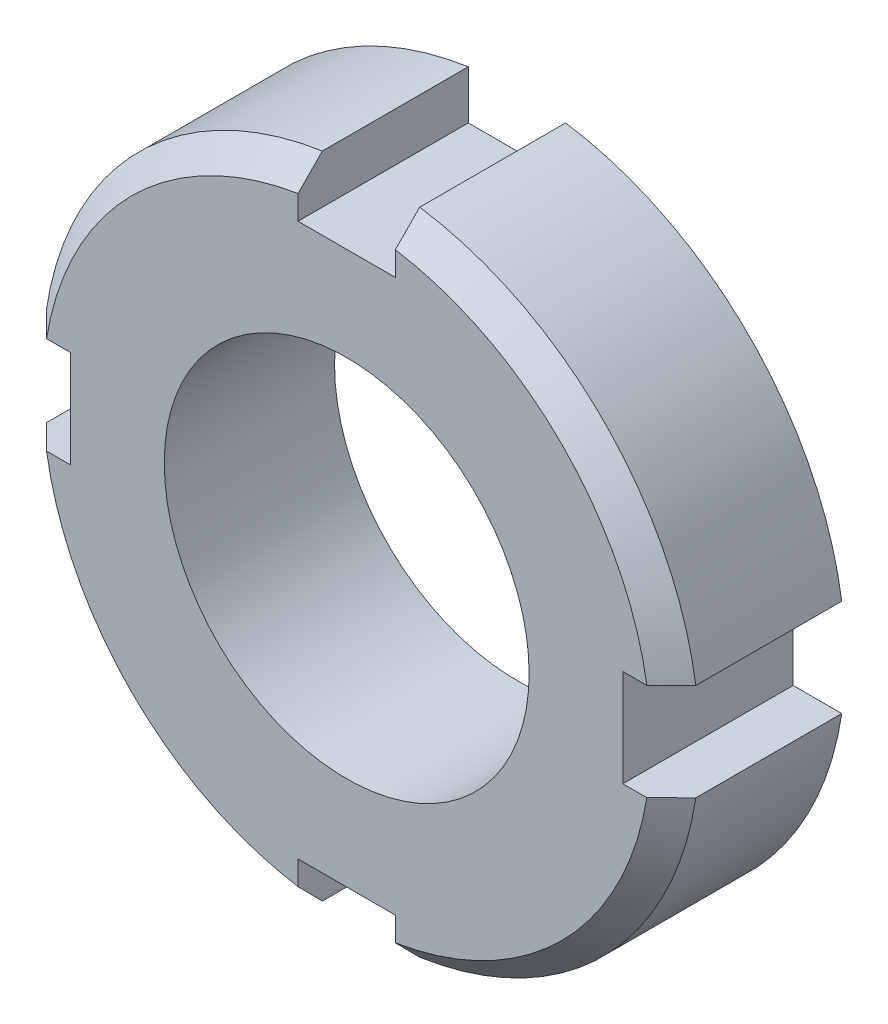
ISO-10303-21;
HEADER;
FILE_DESCRIPTION(('STEP AP214'),'2;1');
FILE_NAME('part.step','',(''),(''),'','','');
FILE_SCHEMA(('AUTOMOTIVE_DESIGN { 1 0 10303 214 1 1 1 1 }'));
ENDSEC;
DATA;
#1=APPLICATION_CONTEXT('core data for automotive mechanical design processes');
#2=APPLICATION_PROTOCOL_DEFINITION('international standard','automotive_design',2000,#1);
#3=PRODUCT_CONTEXT('',#1,'mechanical');
#4=PRODUCT('Part','Part','',(#3));
#5=PRODUCT_RELATED_PRODUCT_CATEGORY('part','',(#4));
#6=PRODUCT_DEFINITION_FORMATION('','',#4);
#7=PRODUCT_DEFINITION_CONTEXT('part definition',#1,'design');
#8=PRODUCT_DEFINITION('design','',#6,#7);
#9=PRODUCT_DEFINITION_SHAPE('','',#8);
#10=(LENGTH_UNIT() NAMED_UNIT(*) SI_UNIT(.MILLI.,.METRE.));
#11=(NAMED_UNIT(*) PLANE_ANGLE_UNIT() SI_UNIT($,.RADIAN.));
#12=(NAMED_UNIT(*) SI_UNIT($,.STERADIAN.) SOLID_ANGLE_UNIT());
#13=UNCERTAINTY_MEASURE_WITH_UNIT(LENGTH_MEASURE(1.E-05),#10,'distance_accuracy_value','');
#14=(GEOMETRIC_REPRESENTATION_CONTEXT(3) GLOBAL_UNCERTAINTY_ASSIGNED_CONTEXT((#13)) GLOBAL_UNIT_ASSIGNED_CONTEXT((#10,
#11,#12)) REPRESENTATION_CONTEXT('',''));
#15=CARTESIAN_POINT('',(0.,0.,0.));
#16=DIRECTION('',(0.,0.,1.));
#17=DIRECTION('',(1.,0.,0.));
#18=AXIS2_PLACEMENT_3D('',#15,#16,#17);
#19=CARTESIAN_POINT('',(0.,0.,7.));
#20=DIRECTION('',(0.,0.,-1.));
#21=DIRECTION('',(-1.,0.,0.));
#22=AXIS2_PLACEMENT_3D('',#19,#20,#21);
#23=CYLINDRICAL_SURFACE('',#22,13.5);
#24=DIRECTION('',(0.,0.,1.));
#25=VECTOR('',#24,1.);
#26=CARTESIAN_POINT('',(-13.351029922821,1.99999999999772,0.));
#27=LINE('',#26,#25);
#28=CARTESIAN_POINT('',(-13.351029922821,1.99999999999772,0.));
#29=VERTEX_POINT('',#28);
#30=CARTESIAN_POINT('',(-13.351029922821,1.99999999999772,6.));
#31=VERTEX_POINT('',#30);
#32=EDGE_CURVE('E572',#29,#31,#27,.T.);
#33=ORIENTED_EDGE('',*,*,#32,.T.);
#34=CARTESIAN_POINT('',(0.,0.,6.));
#35=DIRECTION('',(0.,0.,1.));
#36=DIRECTION('',(1.,0.,0.));
#37=AXIS2_PLACEMENT_3D('',#34,#35,#36);
#38=CIRCLE('',#37,13.5);
#39=CARTESIAN_POINT('',(-2.,13.3510299228187,6.));
#40=VERTEX_POINT('',#39);
#41=EDGE_CURVE('E299',#31,#40,#38,.F.);
#42=ORIENTED_EDGE('',*,*,#41,.T.);
#43=DIRECTION('',(0.,0.,1.));
#44=VECTOR('',#43,1.);
#45=CARTESIAN_POINT('',(-2.,13.3510299228187,0.));
#46=LINE('',#45,#44);
#47=CARTESIAN_POINT('',(-2.,13.3510299228187,0.));
#48=VERTEX_POINT('',#47);
#49=EDGE_CURVE('E276',#48,#40,#46,.T.);
#50=ORIENTED_EDGE('',*,*,#49,.F.);
#51=CARTESIAN_POINT('',(0.,0.,0.));
#52=DIRECTION('',(0.,0.,1.));
#53=DIRECTION('',(1.,0.,0.));
#54=AXIS2_PLACEMENT_3D('',#51,#52,#53);
#55=CIRCLE('',#54,13.5);
#56=EDGE_CURVE('E294',#48,#29,#55,.T.);
#57=ORIENTED_EDGE('',*,*,#56,.T.);
#58=EDGE_LOOP('',(#33,#42,#50,#57));
#59=FACE_BOUND('',#58,.T.);
#60=ADVANCED_FACE('F131',(#59),#23,.T.);
#61=DIRECTION('',(0.,0.,1.));
#62=VECTOR('',#61,1.);
#63=CARTESIAN_POINT('',(2.,13.3510299228187,0.));
#64=LINE('',#63,#62);
#65=CARTESIAN_POINT('',(2.,13.3510299228187,0.));
#66=VERTEX_POINT('',#65);
#67=CARTESIAN_POINT('',(2.,13.3510299228187,6.));
#68=VERTEX_POINT('',#67);
#69=EDGE_CURVE('E442',#66,#68,#64,.T.);
#70=ORIENTED_EDGE('',*,*,#69,.T.);
#71=CARTESIAN_POINT('',(0.,0.,6.));
#72=DIRECTION('',(0.,0.,1.));
#73=DIRECTION('',(1.,0.,0.));
#74=AXIS2_PLACEMENT_3D('',#71,#72,#73);
#75=CIRCLE('',#74,13.5);
#76=CARTESIAN_POINT('',(13.351029922821,1.99999999999773,6.));
#77=VERTEX_POINT('',#76);
#78=EDGE_CURVE('E146',#68,#77,#75,.F.);
#79=ORIENTED_EDGE('',*,*,#78,.T.);
#80=DIRECTION('',(0.,0.,1.));
#81=VECTOR('',#80,1.);
#82=CARTESIAN_POINT('',(13.351029922821,1.99999999999773,0.));
#83=LINE('',#82,#81);
#84=CARTESIAN_POINT('',(13.351029922821,1.99999999999773,0.));
#85=VERTEX_POINT('',#84);
#86=EDGE_CURVE('E482',#85,#77,#83,.T.);
#87=ORIENTED_EDGE('',*,*,#86,.F.);
#88=EDGE_CURVE('E303',#85,#66,#55,.T.);
#89=ORIENTED_EDGE('',*,*,#88,.T.);
#90=EDGE_LOOP('',(#70,#79,#87,#89));
#91=FACE_BOUND('',#90,.T.);
#92=ADVANCED_FACE('F431',(#91),#23,.T.);
#93=DIRECTION('',(0.,0.,1.));
#94=VECTOR('',#93,1.);
#95=CARTESIAN_POINT('',(13.351029922821,-2.00000000000227,0.));
#96=LINE('',#95,#94);
#97=CARTESIAN_POINT('',(13.351029922821,-2.00000000000227,0.));
#98=VERTEX_POINT('',#97);
#99=CARTESIAN_POINT('',(13.351029922821,-2.00000000000227,5.99999999999999));
#100=VERTEX_POINT('',#99);
#101=EDGE_CURVE('E502',#98,#100,#96,.T.);
#102=ORIENTED_EDGE('',*,*,#101,.T.);
#103=CARTESIAN_POINT('',(0.,0.,5.99999999999999));
#104=DIRECTION('',(0.,0.,1.));
#105=DIRECTION('',(1.,0.,0.));
#106=AXIS2_PLACEMENT_3D('',#103,#104,#105);
#107=CIRCLE('',#106,13.5);
#108=CARTESIAN_POINT('',(2.00000000000001,-13.3510299228232,5.99999999999999));
#109=VERTEX_POINT('',#108);
#110=EDGE_CURVE('E345',#100,#109,#107,.F.);
#111=ORIENTED_EDGE('',*,*,#110,.T.);
#112=DIRECTION('',(0.,0.,1.));
#113=VECTOR('',#112,1.);
#114=CARTESIAN_POINT('',(2.00000000000001,-13.3510299228232,0.));
#115=LINE('',#114,#113);
#116=CARTESIAN_POINT('',(2.00000000000001,-13.3510299228232,0.));
#117=VERTEX_POINT('',#116);
#118=EDGE_CURVE('E527',#117,#109,#115,.T.);
#119=ORIENTED_EDGE('',*,*,#118,.F.);
#120=EDGE_CURVE('E311',#117,#98,#55,.T.);
#121=ORIENTED_EDGE('',*,*,#120,.T.);
#122=EDGE_LOOP('',(#102,#111,#119,#121));
#123=FACE_BOUND('',#122,.T.);
#124=ADVANCED_FACE('F426',(#123),#23,.T.);
#125=DIRECTION('',(0.,0.,1.));
#126=VECTOR('',#125,1.);
#127=CARTESIAN_POINT('',(-2.,-13.3510299228232,0.));
#128=LINE('',#127,#126);
#129=CARTESIAN_POINT('',(-2.,-13.3510299228232,0.));
#130=VERTEX_POINT('',#129);
#131=CARTESIAN_POINT('',(-2.,-13.3510299228232,6.));
#132=VERTEX_POINT('',#131);
#133=EDGE_CURVE('E537',#130,#132,#128,.T.);
#134=ORIENTED_EDGE('',*,*,#133,.T.);
#135=CARTESIAN_POINT('',(0.,0.,6.));
#136=DIRECTION('',(0.,0.,1.));
#137=DIRECTION('',(1.,0.,0.));
#138=AXIS2_PLACEMENT_3D('',#135,#136,#137);
#139=CIRCLE('',#138,13.5);
#140=CARTESIAN_POINT('',(-13.351029922821,-2.00000000000228,6.));
#141=VERTEX_POINT('',#140);
#142=EDGE_CURVE('E378',#132,#141,#139,.F.);
#143=ORIENTED_EDGE('',*,*,#142,.T.);
#144=DIRECTION('',(0.,0.,1.));
#145=VECTOR('',#144,1.);
#146=CARTESIAN_POINT('',(-13.351029922821,-2.00000000000228,0.));
#147=LINE('',#146,#145);
#148=CARTESIAN_POINT('',(-13.351029922821,-2.00000000000228,0.));
#149=VERTEX_POINT('',#148);
#150=EDGE_CURVE('E563',#149,#141,#147,.T.);
#151=ORIENTED_EDGE('',*,*,#150,.F.);
#152=EDGE_CURVE('E308',#149,#130,#55,.T.);
#153=ORIENTED_EDGE('',*,*,#152,.T.);
#154=EDGE_LOOP('',(#134,#143,#151,#153));
#155=FACE_BOUND('',#154,.T.);
#156=ADVANCED_FACE('F423',(#155),#23,.T.);
#157=CARTESIAN_POINT('',(0.,0.,7.));
#158=DIRECTION('',(0.,0.,1.));
#159=DIRECTION('',(1.,0.,0.));
#160=AXIS2_PLACEMENT_3D('',#157,#158,#159);
#161=PLANE('',#160);
#162=CARTESIAN_POINT('',(0.,0.,7.));
#163=DIRECTION('',(0.,0.,1.));
#164=DIRECTION('',(1.,0.,0.));
#165=AXIS2_PLACEMENT_3D('',#162,#163,#164);
#166=CIRCLE('',#165,7.5);
#167=CARTESIAN_POINT('',(7.5,0.,7.));
#168=VERTEX_POINT('',#167);
#169=EDGE_CURVE('E820',#168,#168,#166,.T.);
#170=ORIENTED_EDGE('',*,*,#169,.F.);
#171=EDGE_LOOP('',(#170));
#172=FACE_BOUND('',#171,.T.);
#173=DIRECTION('',(0.,1.,0.));
#174=VECTOR('',#173,1.);
#175=CARTESIAN_POINT('',(2.00000000000001,-13.3510299228232,7.));
#176=LINE('',#175,#174);
#177=CARTESIAN_POINT('',(2.00000000000001,-12.3389626792531,7.));
#178=VERTEX_POINT('',#177);
#179=CARTESIAN_POINT('',(2.,-11.3510299228232,7.));
#180=VERTEX_POINT('',#179);
#181=EDGE_CURVE('E508',#178,#180,#176,.T.);
#182=ORIENTED_EDGE('',*,*,#181,.F.);
#183=CARTESIAN_POINT('',(0.,0.,7.));
#184=DIRECTION('',(0.,0.,1.));
#185=DIRECTION('',(1.,0.,0.));
#186=AXIS2_PLACEMENT_3D('',#183,#184,#185);
#187=CIRCLE('',#186,12.5);
#188=CARTESIAN_POINT('',(12.3389626792527,-2.00000000000227,7.));
#189=VERTEX_POINT('',#188);
#190=EDGE_CURVE('E329',#178,#189,#187,.T.);
#191=ORIENTED_EDGE('',*,*,#190,.T.);
#192=DIRECTION('',(1.,0.,0.));
#193=VECTOR('',#192,1.);
#194=CARTESIAN_POINT('',(11.351029922821,-2.00000000000227,7.));
#195=LINE('',#194,#193);
#196=CARTESIAN_POINT('',(11.351029922821,-2.00000000000227,7.));
#197=VERTEX_POINT('',#196);
#198=EDGE_CURVE('E507',#197,#189,#195,.T.);
#199=ORIENTED_EDGE('',*,*,#198,.F.);
#200=DIRECTION('',(0.,-1.,0.));
#201=VECTOR('',#200,1.);
#202=CARTESIAN_POINT('',(11.351029922821,1.99999999999773,7.));
#203=LINE('',#202,#201);
#204=CARTESIAN_POINT('',(11.351029922821,1.99999999999773,7.));
#205=VERTEX_POINT('',#204);
#206=EDGE_CURVE('E514',#205,#197,#203,.T.);
#207=ORIENTED_EDGE('',*,*,#206,.F.);
#208=DIRECTION('',(-1.,0.,0.));
#209=VECTOR('',#208,1.);
#210=CARTESIAN_POINT('',(13.351029922821,1.99999999999773,7.));
#211=LINE('',#210,#209);
#212=CARTESIAN_POINT('',(12.3389626792534,1.99999999999773,7.));
#213=VERTEX_POINT('',#212);
#214=EDGE_CURVE('E520',#213,#205,#211,.T.);
#215=ORIENTED_EDGE('',*,*,#214,.F.);
#216=CARTESIAN_POINT('',(0.,0.,7.));
#217=DIRECTION('',(0.,0.,1.));
#218=DIRECTION('',(1.,0.,0.));
#219=AXIS2_PLACEMENT_3D('',#216,#217,#218);
#220=CIRCLE('',#219,12.5);
#221=CARTESIAN_POINT('',(2.,12.3389626792531,7.));
#222=VERTEX_POINT('',#221);
#223=EDGE_CURVE('E315',#213,#222,#220,.T.);
#224=ORIENTED_EDGE('',*,*,#223,.T.);
#225=DIRECTION('',(0.,1.,0.));
#226=VECTOR('',#225,1.);
#227=CARTESIAN_POINT('',(2.,11.3510299228187,7.));
#228=LINE('',#227,#226);
#229=CARTESIAN_POINT('',(2.,11.3510299228187,7.));
#230=VERTEX_POINT('',#229);
#231=EDGE_CURVE('E288',#230,#222,#228,.T.);
#232=ORIENTED_EDGE('',*,*,#231,.F.);
#233=DIRECTION('',(1.,0.,0.));
#234=VECTOR('',#233,1.);
#235=CARTESIAN_POINT('',(-2.,11.3510299228187,7.));
#236=LINE('',#235,#234);
#237=CARTESIAN_POINT('',(-2.,11.3510299228187,7.));
#238=VERTEX_POINT('',#237);
#239=EDGE_CURVE('E640',#238,#230,#236,.T.);
#240=ORIENTED_EDGE('',*,*,#239,.F.);
#241=DIRECTION('',(0.,-1.,0.));
#242=VECTOR('',#241,1.);
#243=CARTESIAN_POINT('',(-2.,13.3510299228187,7.));
#244=LINE('',#243,#242);
#245=CARTESIAN_POINT('',(-2.,12.3389626792531,7.));
#246=VERTEX_POINT('',#245);
#247=EDGE_CURVE('E517',#246,#238,#244,.T.);
#248=ORIENTED_EDGE('',*,*,#247,.F.);
#249=CARTESIAN_POINT('',(0.,0.,7.));
#250=DIRECTION('',(0.,0.,1.));
#251=DIRECTION('',(1.,0.,0.));
#252=AXIS2_PLACEMENT_3D('',#249,#250,#251);
#253=CIRCLE('',#252,12.5);
#254=CARTESIAN_POINT('',(-12.3389626792534,1.99999999999772,7.));
#255=VERTEX_POINT('',#254);
#256=EDGE_CURVE('E325',#246,#255,#253,.T.);
#257=ORIENTED_EDGE('',*,*,#256,.T.);
#258=DIRECTION('',(-1.,0.,0.));
#259=VECTOR('',#258,1.);
#260=CARTESIAN_POINT('',(-11.351029922821,1.99999999999772,7.));
#261=LINE('',#260,#259);
#262=CARTESIAN_POINT('',(-11.351029922821,1.99999999999772,7.));
#263=VERTEX_POINT('',#262);
#264=EDGE_CURVE('E576',#263,#255,#261,.T.);
#265=ORIENTED_EDGE('',*,*,#264,.F.);
#266=DIRECTION('',(0.,1.,0.));
#267=VECTOR('',#266,1.);
#268=CARTESIAN_POINT('',(-11.351029922821,-2.00000000000228,7.));
#269=LINE('',#268,#267);
#270=CARTESIAN_POINT('',(-11.351029922821,-2.00000000000228,7.));
#271=VERTEX_POINT('',#270);
#272=EDGE_CURVE('E581',#271,#263,#269,.T.);
#273=ORIENTED_EDGE('',*,*,#272,.F.);
#274=DIRECTION('',(1.,0.,0.));
#275=VECTOR('',#274,1.);
#276=CARTESIAN_POINT('',(-13.351029922821,-2.00000000000228,7.));
#277=LINE('',#276,#275);
#278=CARTESIAN_POINT('',(-12.3389626792527,-2.00000000000228,7.));
#279=VERTEX_POINT('',#278);
#280=EDGE_CURVE('E545',#279,#271,#277,.T.);
#281=ORIENTED_EDGE('',*,*,#280,.F.);
#282=CARTESIAN_POINT('',(0.,0.,7.));
#283=DIRECTION('',(0.,0.,1.));
#284=DIRECTION('',(1.,0.,0.));
#285=AXIS2_PLACEMENT_3D('',#282,#283,#284);
#286=CIRCLE('',#285,12.5);
#287=CARTESIAN_POINT('',(-2.,-12.3389626792531,7.));
#288=VERTEX_POINT('',#287);
#289=EDGE_CURVE('E326',#279,#288,#286,.T.);
#290=ORIENTED_EDGE('',*,*,#289,.T.);
#291=DIRECTION('',(0.,-1.,0.));
#292=VECTOR('',#291,1.);
#293=CARTESIAN_POINT('',(-1.99999999999999,-11.3510299228232,7.));
#294=LINE('',#293,#292);
#295=CARTESIAN_POINT('',(-1.99999999999999,-11.3510299228232,7.));
#296=VERTEX_POINT('',#295);
#297=EDGE_CURVE('E543',#296,#288,#294,.T.);
#298=ORIENTED_EDGE('',*,*,#297,.F.);
#299=DIRECTION('',(-1.,0.,0.));
#300=VECTOR('',#299,1.);
#301=CARTESIAN_POINT('',(2.,-11.3510299228232,7.));
#302=LINE('',#301,#300);
#303=EDGE_CURVE('E550',#180,#296,#302,.T.);
#304=ORIENTED_EDGE('',*,*,#303,.F.);
#305=EDGE_LOOP('',(#182,#191,#199,#207,#215,#224,#232,#240,#248,#257,#265,#273,#281,#290,#298,#304));
#306=FACE_BOUND('',#305,.T.);
#307=ADVANCED_FACE('F416',(#172,#306),#161,.T.);
#308=CARTESIAN_POINT('',(0.,0.,0.));
#309=DIRECTION('',(0.,0.,1.));
#310=DIRECTION('',(1.,0.,0.));
#311=AXIS2_PLACEMENT_3D('',#308,#309,#310);
#312=PLANE('',#311);
#313=CARTESIAN_POINT('',(0.,0.,0.));
#314=DIRECTION('',(0.,0.,1.));
#315=DIRECTION('',(1.,0.,0.));
#316=AXIS2_PLACEMENT_3D('',#313,#314,#315);
#317=CIRCLE('',#316,7.5);
#318=CARTESIAN_POINT('',(7.5,0.,0.));
#319=VERTEX_POINT('',#318);
#320=EDGE_CURVE('E579',#319,#319,#317,.T.);
#321=ORIENTED_EDGE('',*,*,#320,.T.);
#322=EDGE_LOOP('',(#321));
#323=FACE_BOUND('',#322,.T.);
#324=DIRECTION('',(1.,0.,0.));
#325=VECTOR('',#324,1.);
#326=CARTESIAN_POINT('',(-2.,11.3510299228187,0.));
#327=LINE('',#326,#325);
#328=CARTESIAN_POINT('',(-2.,11.3510299228187,0.));
#329=VERTEX_POINT('',#328);
#330=CARTESIAN_POINT('',(2.,11.3510299228187,0.));
#331=VERTEX_POINT('',#330);
#332=EDGE_CURVE('E290',#329,#331,#327,.T.);
#333=ORIENTED_EDGE('',*,*,#332,.T.);
#334=DIRECTION('',(0.,1.,0.));
#335=VECTOR('',#334,1.);
#336=CARTESIAN_POINT('',(2.,11.3510299228187,0.));
#337=LINE('',#336,#335);
#338=EDGE_CURVE('E300',#331,#66,#337,.T.);
#339=ORIENTED_EDGE('',*,*,#338,.T.);
#340=ORIENTED_EDGE('',*,*,#88,.F.);
#341=DIRECTION('',(-1.,0.,0.));
#342=VECTOR('',#341,1.);
#343=CARTESIAN_POINT('',(13.351029922821,1.99999999999773,0.));
#344=LINE('',#343,#342);
#345=CARTESIAN_POINT('',(11.351029922821,1.99999999999773,0.));
#346=VERTEX_POINT('',#345);
#347=EDGE_CURVE('E490',#85,#346,#344,.T.);
#348=ORIENTED_EDGE('',*,*,#347,.T.);
#349=DIRECTION('',(0.,-1.,0.));
#350=VECTOR('',#349,1.);
#351=CARTESIAN_POINT('',(11.351029922821,1.99999999999773,0.));
#352=LINE('',#351,#350);
#353=CARTESIAN_POINT('',(11.351029922821,-2.00000000000227,0.));
#354=VERTEX_POINT('',#353);
#355=EDGE_CURVE('E497',#346,#354,#352,.T.);
#356=ORIENTED_EDGE('',*,*,#355,.T.);
#357=DIRECTION('',(1.,0.,0.));
#358=VECTOR('',#357,1.);
#359=CARTESIAN_POINT('',(11.351029922821,-2.00000000000227,0.));
#360=LINE('',#359,#358);
#361=EDGE_CURVE('E487',#354,#98,#360,.T.);
#362=ORIENTED_EDGE('',*,*,#361,.T.);
#363=ORIENTED_EDGE('',*,*,#120,.F.);
#364=DIRECTION('',(0.,1.,0.));
#365=VECTOR('',#364,1.);
#366=CARTESIAN_POINT('',(2.00000000000001,-13.3510299228232,0.));
#367=LINE('',#366,#365);
#368=CARTESIAN_POINT('',(2.,-11.3510299228232,0.));
#369=VERTEX_POINT('',#368);
#370=EDGE_CURVE('E547',#117,#369,#367,.T.);
#371=ORIENTED_EDGE('',*,*,#370,.T.);
#372=DIRECTION('',(-1.,0.,0.));
#373=VECTOR('',#372,1.);
#374=CARTESIAN_POINT('',(2.,-11.3510299228232,0.));
#375=LINE('',#374,#373);
#376=CARTESIAN_POINT('',(-1.99999999999999,-11.3510299228232,0.));
#377=VERTEX_POINT('',#376);
#378=EDGE_CURVE('E556',#369,#377,#375,.T.);
#379=ORIENTED_EDGE('',*,*,#378,.T.);
#380=DIRECTION('',(0.,-1.,0.));
#381=VECTOR('',#380,1.);
#382=CARTESIAN_POINT('',(-1.99999999999999,-11.3510299228232,0.));
#383=LINE('',#382,#381);
#384=EDGE_CURVE('E533',#377,#130,#383,.T.);
#385=ORIENTED_EDGE('',*,*,#384,.T.);
#386=ORIENTED_EDGE('',*,*,#152,.F.);
#387=DIRECTION('',(1.,0.,0.));
#388=VECTOR('',#387,1.);
#389=CARTESIAN_POINT('',(-13.351029922821,-2.00000000000228,0.));
#390=LINE('',#389,#388);
#391=CARTESIAN_POINT('',(-11.351029922821,-2.00000000000228,0.));
#392=VERTEX_POINT('',#391);
#393=EDGE_CURVE('E320',#149,#392,#390,.T.);
#394=ORIENTED_EDGE('',*,*,#393,.T.);
#395=DIRECTION('',(0.,1.,0.));
#396=VECTOR('',#395,1.);
#397=CARTESIAN_POINT('',(-11.351029922821,-2.00000000000228,0.));
#398=LINE('',#397,#396);
#399=CARTESIAN_POINT('',(-11.351029922821,1.99999999999772,0.));
#400=VERTEX_POINT('',#399);
#401=EDGE_CURVE('E587',#392,#400,#398,.T.);
#402=ORIENTED_EDGE('',*,*,#401,.T.);
#403=DIRECTION('',(-1.,0.,0.));
#404=VECTOR('',#403,1.);
#405=CARTESIAN_POINT('',(-11.351029922821,1.99999999999772,0.));
#406=LINE('',#405,#404);
#407=EDGE_CURVE('E304',#400,#29,#406,.T.);
#408=ORIENTED_EDGE('',*,*,#407,.T.);
#409=ORIENTED_EDGE('',*,*,#56,.F.);
#410=DIRECTION('',(0.,-1.,0.));
#411=VECTOR('',#410,1.);
#412=CARTESIAN_POINT('',(-2.,13.3510299228187,0.));
#413=LINE('',#412,#411);
#414=EDGE_CURVE('E277',#48,#329,#413,.T.);
#415=ORIENTED_EDGE('',*,*,#414,.T.);
#416=EDGE_LOOP('',(#333,#339,#340,#348,#356,#362,#363,#371,#379,#385,#386,#394,#402,#408,#409,#415));
#417=FACE_BOUND('',#416,.T.);
#418=ADVANCED_FACE('F302',(#323,#417),#312,.F.);
#419=CARTESIAN_POINT('',(-11.351029922821,1.99999999999772,0.));
#420=DIRECTION('',(0.,1.,0.));
#421=DIRECTION('',(-1.,0.,0.));
#422=AXIS2_PLACEMENT_3D('',#419,#420,#421);
#423=PLANE('',#422);
#424=ORIENTED_EDGE('',*,*,#264,.T.);
#425=CARTESIAN_POINT('',(-12.3389626792534,1.99999999999772,7.));
#426=CARTESIAN_POINT('',(-12.507718368796,1.99999999999772,6.83341208726107));
#427=CARTESIAN_POINT('',(-12.6764351507077,1.99999999999772,6.66678479738352));
#428=CARTESIAN_POINT('',(-13.0137908985626,1.99999999999772,6.33345146404985));
#429=CARTESIAN_POINT('',(-13.1824298645061,1.99999999999772,6.16674542059406));
#430=CARTESIAN_POINT('',(-13.3510299228191,1.99999999999772,5.99999999999998));
#431=B_SPLINE_CURVE_WITH_KNOTS('',3,(#425,#426,#427,#428,#429,#430),.UNSPECIFIED.,.F.,.F.,(4,2,
4),(0.,0.71138601059862,1.42277201821501),.UNSPECIFIED.);
#432=EDGE_CURVE('E405',#255,#31,#431,.T.);
#433=ORIENTED_EDGE('',*,*,#432,.T.);
#434=ORIENTED_EDGE('',*,*,#32,.F.);
#435=ORIENTED_EDGE('',*,*,#407,.F.);
#436=DIRECTION('',(0.,0.,1.));
#437=VECTOR('',#436,1.);
#438=CARTESIAN_POINT('',(-11.351029922821,1.99999999999772,0.));
#439=LINE('',#438,#437);
#440=EDGE_CURVE('E571',#400,#263,#439,.T.);
#441=ORIENTED_EDGE('',*,*,#440,.T.);
#442=EDGE_LOOP('',(#424,#433,#434,#435,#441));
#443=FACE_BOUND('',#442,.T.);
#444=ADVANCED_FACE('F414',(#443),#423,.F.);
#445=CARTESIAN_POINT('',(-11.351029922821,-2.00000000000228,0.));
#446=DIRECTION('',(1.,0.,0.));
#447=DIRECTION('',(0.,0.,-1.));
#448=AXIS2_PLACEMENT_3D('',#445,#446,#447);
#449=PLANE('',#448);
#450=ORIENTED_EDGE('',*,*,#272,.T.);
#451=ORIENTED_EDGE('',*,*,#440,.F.);
#452=ORIENTED_EDGE('',*,*,#401,.F.);
#453=DIRECTION('',(0.,0.,1.));
#454=VECTOR('',#453,1.);
#455=CARTESIAN_POINT('',(-11.351029922821,-2.00000000000228,0.));
#456=LINE('',#455,#454);
#457=EDGE_CURVE('E566',#392,#271,#456,.T.);
#458=ORIENTED_EDGE('',*,*,#457,.T.);
#459=EDGE_LOOP('',(#450,#451,#452,#458));
#460=FACE_BOUND('',#459,.T.);
#461=ADVANCED_FACE('F391',(#460),#449,.F.);
#462=CARTESIAN_POINT('',(-13.351029922821,-2.00000000000228,0.));
#463=DIRECTION('',(0.,-1.,0.));
#464=DIRECTION('',(1.,0.,0.));
#465=AXIS2_PLACEMENT_3D('',#462,#463,#464);
#466=PLANE('',#465);
#467=ORIENTED_EDGE('',*,*,#150,.T.);
#468=CARTESIAN_POINT('',(-13.3510299228184,-2.0000000000019,6.));
#469=CARTESIAN_POINT('',(-13.1824298645054,-2.00000000000209,6.16674542059407));
#470=CARTESIAN_POINT('',(-13.0137908985619,-2.00000000000221,6.33345146404985));
#471=CARTESIAN_POINT('',(-12.676435150707,-2.00000000000234,6.66678479738351));
#472=CARTESIAN_POINT('',(-12.5077183687952,-2.00000000000234,6.83341208726107));
#473=CARTESIAN_POINT('',(-12.3389626792527,-2.00000000000228,7.));
#474=B_SPLINE_CURVE_WITH_KNOTS('',3,(#468,#469,#470,#471,#472,#473),.UNSPECIFIED.,.F.,.F.,(4,2,
4),(0.,0.711386007616407,1.42277201821505),.UNSPECIFIED.);
#475=EDGE_CURVE('E392',#141,#279,#474,.T.);
#476=ORIENTED_EDGE('',*,*,#475,.T.);
#477=ORIENTED_EDGE('',*,*,#280,.T.);
#478=ORIENTED_EDGE('',*,*,#457,.F.);
#479=ORIENTED_EDGE('',*,*,#393,.F.);
#480=EDGE_LOOP('',(#467,#476,#477,#478,#479));
#481=FACE_BOUND('',#480,.T.);
#482=ADVANCED_FACE('F390',(#481),#466,.F.);
#483=CARTESIAN_POINT('',(-1.99999999999999,-11.3510299228232,0.));
#484=DIRECTION('',(-1.,0.,0.));
#485=DIRECTION('',(0.,-1.,0.));
#486=AXIS2_PLACEMENT_3D('',#483,#484,#485);
#487=PLANE('',#486);
#488=ORIENTED_EDGE('',*,*,#297,.T.);
#489=CARTESIAN_POINT('',(-2.,-12.3389626792531,7.));
#490=CARTESIAN_POINT('',(-2.,-12.5077183687956,6.83341208726107));
#491=CARTESIAN_POINT('',(-2.,-12.6764351507074,6.66678479738351));
#492=CARTESIAN_POINT('',(-2.,-13.0137908985623,6.33345146404983));
#493=CARTESIAN_POINT('',(-2.,-13.1824298645057,6.16674542059404));
#494=CARTESIAN_POINT('',(-2.,-13.3510299228187,5.99999999999995));
#495=B_SPLINE_CURVE_WITH_KNOTS('',3,(#489,#490,#491,#492,#493,#494),.UNSPECIFIED.,.F.,.F.,(4,2,
4),(0.,0.711386010598648,1.42277201821506),.UNSPECIFIED.);
#496=EDGE_CURVE('E371',#288,#132,#495,.T.);
#497=ORIENTED_EDGE('',*,*,#496,.T.);
#498=ORIENTED_EDGE('',*,*,#133,.F.);
#499=ORIENTED_EDGE('',*,*,#384,.F.);
#500=DIRECTION('',(0.,0.,1.));
#501=VECTOR('',#500,1.);
#502=CARTESIAN_POINT('',(-1.99999999999999,-11.3510299228232,0.));
#503=LINE('',#502,#501);
#504=EDGE_CURVE('E536',#377,#296,#503,.T.);
#505=ORIENTED_EDGE('',*,*,#504,.T.);
#506=EDGE_LOOP('',(#488,#497,#498,#499,#505));
#507=FACE_BOUND('',#506,.T.);
#508=ADVANCED_FACE('F382',(#507),#487,.F.);
#509=CARTESIAN_POINT('',(2.,-11.3510299228232,0.));
#510=DIRECTION('',(0.,1.,0.));
#511=DIRECTION('',(0.,0.,1.));
#512=AXIS2_PLACEMENT_3D('',#509,#510,#511);
#513=PLANE('',#512);
#514=ORIENTED_EDGE('',*,*,#303,.T.);
#515=ORIENTED_EDGE('',*,*,#504,.F.);
#516=ORIENTED_EDGE('',*,*,#378,.F.);
#517=DIRECTION('',(0.,0.,1.));
#518=VECTOR('',#517,1.);
#519=CARTESIAN_POINT('',(2.,-11.3510299228232,0.));
#520=LINE('',#519,#518);
#521=EDGE_CURVE('E535',#369,#180,#520,.T.);
#522=ORIENTED_EDGE('',*,*,#521,.T.);
#523=EDGE_LOOP('',(#514,#515,#516,#522));
#524=FACE_BOUND('',#523,.T.);
#525=ADVANCED_FACE('F363',(#524),#513,.F.);
#526=CARTESIAN_POINT('',(2.00000000000001,-13.3510299228232,0.));
#527=DIRECTION('',(1.,0.,0.));
#528=DIRECTION('',(0.,1.,0.));
#529=AXIS2_PLACEMENT_3D('',#526,#527,#528);
#530=PLANE('',#529);
#531=ORIENTED_EDGE('',*,*,#118,.T.);
#532=CARTESIAN_POINT('',(1.99999999999934,-13.3510299228188,5.99999999999999));
#533=CARTESIAN_POINT('',(1.99999999999967,-13.1824298645058,6.16674542059406));
#534=CARTESIAN_POINT('',(1.99999999999989,-13.0137908985623,6.33345146404983));
#535=CARTESIAN_POINT('',(2.00000000000012,-12.6764351507074,6.6667847973835));
#536=CARTESIAN_POINT('',(2.00000000000012,-12.5077183687956,6.83341208726106));
#537=CARTESIAN_POINT('',(2.00000000000001,-12.3389626792531,7.));
#538=B_SPLINE_CURVE_WITH_KNOTS('',3,(#532,#533,#534,#535,#536,#537),.UNSPECIFIED.,.F.,.F.,(4,2,
4),(0.,0.711386007616423,1.42277201821508),.UNSPECIFIED.);
#539=EDGE_CURVE('E365',#109,#178,#538,.T.);
#540=ORIENTED_EDGE('',*,*,#539,.T.);
#541=ORIENTED_EDGE('',*,*,#181,.T.);
#542=ORIENTED_EDGE('',*,*,#521,.F.);
#543=ORIENTED_EDGE('',*,*,#370,.F.);
#544=EDGE_LOOP('',(#531,#540,#541,#542,#543));
#545=FACE_BOUND('',#544,.T.);
#546=ADVANCED_FACE('F357',(#545),#530,.F.);
#547=CARTESIAN_POINT('',(11.351029922821,-2.00000000000227,0.));
#548=DIRECTION('',(0.,-1.,0.));
#549=DIRECTION('',(1.,0.,0.));
#550=AXIS2_PLACEMENT_3D('',#547,#548,#549);
#551=PLANE('',#550);
#552=ORIENTED_EDGE('',*,*,#198,.T.);
#553=CARTESIAN_POINT('',(12.3389626792527,-2.00000000000227,7.));
#554=CARTESIAN_POINT('',(12.5077183687952,-2.00000000000227,6.83341208726107));
#555=CARTESIAN_POINT('',(12.676435150707,-2.00000000000227,6.66678479738352));
#556=CARTESIAN_POINT('',(13.0137908985619,-2.00000000000227,6.33345146404984));
#557=CARTESIAN_POINT('',(13.1824298645054,-2.00000000000227,6.16674542059405));
#558=CARTESIAN_POINT('',(13.3510299228184,-2.00000000000227,5.99999999999996));
#559=B_SPLINE_CURVE_WITH_KNOTS('',3,(#553,#554,#555,#556,#557,#558),.UNSPECIFIED.,.F.,.F.,(4,2,
4),(0.,0.711386010598651,1.42277201821507),.UNSPECIFIED.);
#560=EDGE_CURVE('E331',#189,#100,#559,.T.);
#561=ORIENTED_EDGE('',*,*,#560,.T.);
#562=ORIENTED_EDGE('',*,*,#101,.F.);
#563=ORIENTED_EDGE('',*,*,#361,.F.);
#564=DIRECTION('',(0.,0.,1.));
#565=VECTOR('',#564,1.);
#566=CARTESIAN_POINT('',(11.351029922821,-2.00000000000227,0.));
#567=LINE('',#566,#565);
#568=EDGE_CURVE('E496',#354,#197,#567,.T.);
#569=ORIENTED_EDGE('',*,*,#568,.T.);
#570=EDGE_LOOP('',(#552,#561,#562,#563,#569));
#571=FACE_BOUND('',#570,.T.);
#572=ADVANCED_FACE('F348',(#571),#551,.F.);
#573=CARTESIAN_POINT('',(11.351029922821,1.99999999999773,0.));
#574=DIRECTION('',(-1.,0.,0.));
#575=DIRECTION('',(0.,0.,1.));
#576=AXIS2_PLACEMENT_3D('',#573,#574,#575);
#577=PLANE('',#576);
#578=ORIENTED_EDGE('',*,*,#206,.T.);
#579=ORIENTED_EDGE('',*,*,#568,.F.);
#580=ORIENTED_EDGE('',*,*,#355,.F.);
#581=DIRECTION('',(0.,0.,1.));
#582=VECTOR('',#581,1.);
#583=CARTESIAN_POINT('',(11.351029922821,1.99999999999773,0.));
#584=LINE('',#583,#582);
#585=EDGE_CURVE('E489',#346,#205,#584,.T.);
#586=ORIENTED_EDGE('',*,*,#585,.T.);
#587=EDGE_LOOP('',(#578,#579,#580,#586));
#588=FACE_BOUND('',#587,.T.);
#589=ADVANCED_FACE('F352',(#588),#577,.F.);
#590=CARTESIAN_POINT('',(13.351029922821,1.99999999999773,0.));
#591=DIRECTION('',(0.,1.,0.));
#592=DIRECTION('',(-1.,0.,0.));
#593=AXIS2_PLACEMENT_3D('',#590,#591,#592);
#594=PLANE('',#593);
#595=ORIENTED_EDGE('',*,*,#86,.T.);
#596=CARTESIAN_POINT('',(13.3510299228191,1.99999999999745,6.));
#597=CARTESIAN_POINT('',(13.1824298645061,1.99999999999759,6.16674542059407));
#598=CARTESIAN_POINT('',(13.0137908985626,1.99999999999768,6.33345146404985));
#599=CARTESIAN_POINT('',(12.6764351507077,1.99999999999778,6.66678479738352));
#600=CARTESIAN_POINT('',(12.507718368796,1.99999999999778,6.83341208726107));
#601=CARTESIAN_POINT('',(12.3389626792534,1.99999999999773,7.));
#602=B_SPLINE_CURVE_WITH_KNOTS('',3,(#596,#597,#598,#599,#600,#601),.UNSPECIFIED.,.F.,.F.,(4,2,
4),(0.,0.711386007616385,1.42277201821501),.UNSPECIFIED.);
#603=EDGE_CURVE('E13',#77,#213,#602,.T.);
#604=ORIENTED_EDGE('',*,*,#603,.T.);
#605=ORIENTED_EDGE('',*,*,#214,.T.);
#606=ORIENTED_EDGE('',*,*,#585,.F.);
#607=ORIENTED_EDGE('',*,*,#347,.F.);
#608=EDGE_LOOP('',(#595,#604,#605,#606,#607));
#609=FACE_BOUND('',#608,.T.);
#610=ADVANCED_FACE('F473',(#609),#594,.F.);
#611=CARTESIAN_POINT('',(2.,11.3510299228187,0.));
#612=DIRECTION('',(1.,0.,0.));
#613=DIRECTION('',(0.,1.,0.));
#614=AXIS2_PLACEMENT_3D('',#611,#612,#613);
#615=PLANE('',#614);
#616=ORIENTED_EDGE('',*,*,#231,.T.);
#617=CARTESIAN_POINT('',(2.,12.3389626792531,7.));
#618=CARTESIAN_POINT('',(2.,12.5077183687956,6.83341208726108));
#619=CARTESIAN_POINT('',(2.,12.6764351507074,6.66678479738353));
#620=CARTESIAN_POINT('',(2.,13.0137908985623,6.33345146404986));
#621=CARTESIAN_POINT('',(2.,13.1824298645057,6.16674542059408));
#622=CARTESIAN_POINT('',(2.,13.3510299228187,6.));
#623=B_SPLINE_CURVE_WITH_KNOTS('',3,(#617,#618,#619,#620,#621,#622),.UNSPECIFIED.,.F.,.F.,(4,2,
4),(0.,0.711386010598615,1.42277201821499),.UNSPECIFIED.);
#624=EDGE_CURVE('E165',#222,#68,#623,.T.);
#625=ORIENTED_EDGE('',*,*,#624,.T.);
#626=ORIENTED_EDGE('',*,*,#69,.F.);
#627=ORIENTED_EDGE('',*,*,#338,.F.);
#628=DIRECTION('',(0.,0.,1.));
#629=VECTOR('',#628,1.);
#630=CARTESIAN_POINT('',(2.,11.3510299228187,0.));
#631=LINE('',#630,#629);
#632=EDGE_CURVE('E443',#331,#230,#631,.T.);
#633=ORIENTED_EDGE('',*,*,#632,.T.);
#634=EDGE_LOOP('',(#616,#625,#626,#627,#633));
#635=FACE_BOUND('',#634,.T.);
#636=ADVANCED_FACE('F462',(#635),#615,.F.);
#637=CARTESIAN_POINT('',(-2.,11.3510299228187,0.));
#638=DIRECTION('',(0.,-1.,0.));
#639=DIRECTION('',(0.,0.,-1.));
#640=AXIS2_PLACEMENT_3D('',#637,#638,#639);
#641=PLANE('',#640);
#642=ORIENTED_EDGE('',*,*,#239,.T.);
#643=ORIENTED_EDGE('',*,*,#632,.F.);
#644=ORIENTED_EDGE('',*,*,#332,.F.);
#645=DIRECTION('',(0.,0.,1.));
#646=VECTOR('',#645,1.);
#647=CARTESIAN_POINT('',(-2.,11.3510299228187,0.));
#648=LINE('',#647,#646);
#649=EDGE_CURVE('E281',#329,#238,#648,.T.);
#650=ORIENTED_EDGE('',*,*,#649,.T.);
#651=EDGE_LOOP('',(#642,#643,#644,#650));
#652=FACE_BOUND('',#651,.T.);
#653=ADVANCED_FACE('F468',(#652),#641,.F.);
#654=CARTESIAN_POINT('',(-2.,13.3510299228187,0.));
#655=DIRECTION('',(-1.,0.,0.));
#656=DIRECTION('',(0.,-1.,0.));
#657=AXIS2_PLACEMENT_3D('',#654,#655,#656);
#658=PLANE('',#657);
#659=ORIENTED_EDGE('',*,*,#49,.T.);
#660=CARTESIAN_POINT('',(-2.,13.3510299228187,6.));
#661=CARTESIAN_POINT('',(-2.,13.1824298645057,6.16674542059408));
#662=CARTESIAN_POINT('',(-2.,13.0137908985623,6.33345146404986));
#663=CARTESIAN_POINT('',(-2.,12.6764351507074,6.66678479738353));
#664=CARTESIAN_POINT('',(-2.,12.5077183687956,6.83341208726108));
#665=CARTESIAN_POINT('',(-2.,12.3389626792531,7.));
#666=B_SPLINE_CURVE_WITH_KNOTS('',3,(#660,#661,#662,#663,#664,#665),.UNSPECIFIED.,.F.,.F.,(4,2,
4),(0.,0.711386007616383,1.422772018215),.UNSPECIFIED.);
#667=EDGE_CURVE('E455',#40,#246,#666,.T.);
#668=ORIENTED_EDGE('',*,*,#667,.T.);
#669=ORIENTED_EDGE('',*,*,#247,.T.);
#670=ORIENTED_EDGE('',*,*,#649,.F.);
#671=ORIENTED_EDGE('',*,*,#414,.F.);
#672=EDGE_LOOP('',(#659,#668,#669,#670,#671));
#673=FACE_BOUND('',#672,.T.);
#674=ADVANCED_FACE('F279',(#673),#658,.F.);
#675=CARTESIAN_POINT('',(0.,0.,0.));
#676=DIRECTION('',(0.,0.,1.));
#677=DIRECTION('',(1.,0.,0.));
#678=AXIS2_PLACEMENT_3D('',#675,#676,#677);
#679=CYLINDRICAL_SURFACE('',#678,7.5);
#680=ORIENTED_EDGE('',*,*,#320,.F.);
#681=EDGE_LOOP('',(#680));
#682=FACE_BOUND('',#681,.T.);
#683=ORIENTED_EDGE('',*,*,#169,.T.);
#684=EDGE_LOOP('',(#683));
#685=FACE_BOUND('',#684,.T.);
#686=ADVANCED_FACE('F472',(#682,#685),#679,.F.);
#687=CARTESIAN_POINT('',(0.,0.,7.));
#688=DIRECTION('',(0.,0.,-1.));
#689=DIRECTION('',(-1.,0.,0.));
#690=AXIS2_PLACEMENT_3D('',#687,#688,#689);
#691=CONICAL_SURFACE('',#690,12.5,0.785398163397448);
#692=ORIENTED_EDGE('',*,*,#539,.F.);
#693=ORIENTED_EDGE('',*,*,#110,.F.);
#694=ORIENTED_EDGE('',*,*,#560,.F.);
#695=ORIENTED_EDGE('',*,*,#190,.F.);
#696=EDGE_LOOP('',(#692,#693,#694,#695));
#697=FACE_BOUND('',#696,.T.);
#698=ADVANCED_FACE('F347',(#697),#691,.T.);
#699=CARTESIAN_POINT('',(0.,0.,7.));
#700=DIRECTION('',(0.,0.,-1.));
#701=DIRECTION('',(-1.,0.,0.));
#702=AXIS2_PLACEMENT_3D('',#699,#700,#701);
#703=CONICAL_SURFACE('',#702,12.5,0.785398163397447);
#704=ORIENTED_EDGE('',*,*,#475,.F.);
#705=ORIENTED_EDGE('',*,*,#142,.F.);
#706=ORIENTED_EDGE('',*,*,#496,.F.);
#707=ORIENTED_EDGE('',*,*,#289,.F.);
#708=EDGE_LOOP('',(#704,#705,#706,#707));
#709=FACE_BOUND('',#708,.T.);
#710=ADVANCED_FACE('F381',(#709),#703,.T.);
#711=CARTESIAN_POINT('',(0.,0.,7.));
#712=DIRECTION('',(0.,0.,-1.));
#713=DIRECTION('',(-1.,0.,0.));
#714=AXIS2_PLACEMENT_3D('',#711,#712,#713);
#715=CONICAL_SURFACE('',#714,12.5,0.785398163397448);
#716=ORIENTED_EDGE('',*,*,#667,.F.);
#717=ORIENTED_EDGE('',*,*,#41,.F.);
#718=ORIENTED_EDGE('',*,*,#432,.F.);
#719=ORIENTED_EDGE('',*,*,#256,.F.);
#720=EDGE_LOOP('',(#716,#717,#718,#719));
#721=FACE_BOUND('',#720,.T.);
#722=ADVANCED_FACE('F412',(#721),#715,.T.);
#723=CARTESIAN_POINT('',(0.,0.,7.));
#724=DIRECTION('',(0.,0.,-1.));
#725=DIRECTION('',(-1.,0.,0.));
#726=AXIS2_PLACEMENT_3D('',#723,#724,#725);
#727=CONICAL_SURFACE('',#726,12.5,0.785398163397447);
#728=ORIENTED_EDGE('',*,*,#603,.F.);
#729=ORIENTED_EDGE('',*,*,#78,.F.);
#730=ORIENTED_EDGE('',*,*,#624,.F.);
#731=ORIENTED_EDGE('',*,*,#223,.F.);
#732=EDGE_LOOP('',(#728,#729,#730,#731));
#733=FACE_BOUND('',#732,.T.);
#734=ADVANCED_FACE('F132',(#733),#727,.T.);
#735=CLOSED_SHELL('',(#60,#92,#124,#156,#307,#418,#444,#461,#482,#508,#525,#546,#572,#589,#610,
#636,#653,#674,#686,#698,#710,#722,#734));
#736=MANIFOLD_SOLID_BREP('B2',#735);
#737=ADVANCED_BREP_SHAPE_REPRESENTATION('',(#18,#736),#14);
#738=SHAPE_DEFINITION_REPRESENTATION(#9,#737);
ENDSEC;
END-ISO-10303-21;
